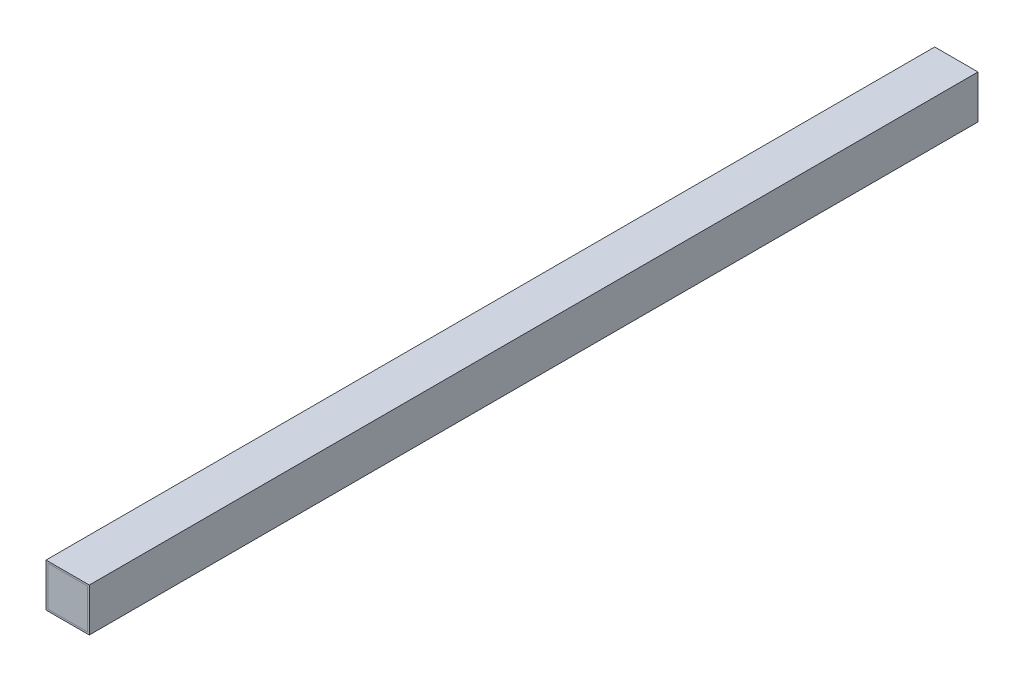
ISO-10303-21;
HEADER;
FILE_DESCRIPTION(('STEP AP214'),'2;1');
FILE_NAME('part.step','',(''),(''),'','','');
FILE_SCHEMA(('AUTOMOTIVE_DESIGN { 1 0 10303 214 1 1 1 1 }'));
ENDSEC;
DATA;
#1=APPLICATION_CONTEXT('core data for automotive mechanical design processes');
#2=APPLICATION_PROTOCOL_DEFINITION('international standard','automotive_design',2000,#1);
#3=PRODUCT_CONTEXT('',#1,'mechanical');
#4=PRODUCT('Part','Part','',(#3));
#5=PRODUCT_RELATED_PRODUCT_CATEGORY('part','',(#4));
#6=PRODUCT_DEFINITION_FORMATION('','',#4);
#7=PRODUCT_DEFINITION_CONTEXT('part definition',#1,'design');
#8=PRODUCT_DEFINITION('design','',#6,#7);
#9=PRODUCT_DEFINITION_SHAPE('','',#8);
#10=(LENGTH_UNIT() NAMED_UNIT(*) SI_UNIT(.MILLI.,.METRE.));
#11=(NAMED_UNIT(*) PLANE_ANGLE_UNIT() SI_UNIT($,.RADIAN.));
#12=(NAMED_UNIT(*) SI_UNIT($,.STERADIAN.) SOLID_ANGLE_UNIT());
#13=UNCERTAINTY_MEASURE_WITH_UNIT(LENGTH_MEASURE(1.E-05),#10,'distance_accuracy_value','');
#14=(GEOMETRIC_REPRESENTATION_CONTEXT(3) GLOBAL_UNCERTAINTY_ASSIGNED_CONTEXT((#13)) GLOBAL_UNIT_ASSIGNED_CONTEXT((#10,
#11,#12)) REPRESENTATION_CONTEXT('',''));
#15=CARTESIAN_POINT('',(0.,0.,0.));
#16=DIRECTION('',(0.,0.,1.));
#17=DIRECTION('',(1.,0.,0.));
#18=AXIS2_PLACEMENT_3D('',#15,#16,#17);
#19=CARTESIAN_POINT('',(-12.1805,12.1805,500.));
#20=DIRECTION('',(1.,0.,0.));
#21=DIRECTION('',(0.,1.,0.));
#22=AXIS2_PLACEMENT_3D('',#19,#20,#21);
#23=PLANE('',#22);
#24=DIRECTION('',(0.,-1.,0.));
#25=VECTOR('',#24,1.);
#26=CARTESIAN_POINT('',(-12.1805,12.1805,0.));
#27=LINE('',#26,#25);
#28=CARTESIAN_POINT('',(-12.1805,12.1805,0.));
#29=VERTEX_POINT('',#28);
#30=CARTESIAN_POINT('',(-12.1805,-12.1805,0.));
#31=VERTEX_POINT('',#30);
#32=EDGE_CURVE('P0_E138',#29,#31,#27,.T.);
#33=ORIENTED_EDGE('',*,*,#32,.T.);
#34=DIRECTION('',(0.,0.,-1.));
#35=VECTOR('',#34,1.);
#36=CARTESIAN_POINT('',(-12.1805,-12.1805,500.));
#37=LINE('',#36,#35);
#38=CARTESIAN_POINT('',(-12.1805,-12.1805,500.));
#39=VERTEX_POINT('',#38);
#40=EDGE_CURVE('P0_E11',#39,#31,#37,.T.);
#41=ORIENTED_EDGE('',*,*,#40,.F.);
#42=DIRECTION('',(0.,-1.,0.));
#43=VECTOR('',#42,1.);
#44=CARTESIAN_POINT('',(-12.1805,12.1805,500.));
#45=LINE('',#44,#43);
#46=CARTESIAN_POINT('',(-12.1805,12.1805,500.));
#47=VERTEX_POINT('',#46);
#48=EDGE_CURVE('P0_E142',#47,#39,#45,.T.);
#49=ORIENTED_EDGE('',*,*,#48,.F.);
#50=DIRECTION('',(0.,0.,-1.));
#51=VECTOR('',#50,1.);
#52=CARTESIAN_POINT('',(-12.1805,12.1805,500.));
#53=LINE('',#52,#51);
#54=EDGE_CURVE('P0_E152',#47,#29,#53,.T.);
#55=ORIENTED_EDGE('',*,*,#54,.T.);
#56=EDGE_LOOP('',(#33,#41,#49,#55));
#57=FACE_BOUND('',#56,.T.);
#58=ADVANCED_FACE('P0_F41',(#57),#23,.F.);
#59=CARTESIAN_POINT('',(-12.1805,-12.1805,500.));
#60=DIRECTION('',(0.,1.,0.));
#61=DIRECTION('',(0.,0.,1.));
#62=AXIS2_PLACEMENT_3D('',#59,#60,#61);
#63=PLANE('',#62);
#64=DIRECTION('',(1.,0.,0.));
#65=VECTOR('',#64,1.);
#66=CARTESIAN_POINT('',(-12.1805,-12.1805,0.));
#67=LINE('',#66,#65);
#68=CARTESIAN_POINT('',(12.1805,-12.1805,0.));
#69=VERTEX_POINT('',#68);
#70=EDGE_CURVE('P0_E155',#31,#69,#67,.T.);
#71=ORIENTED_EDGE('',*,*,#70,.T.);
#72=DIRECTION('',(0.,0.,-1.));
#73=VECTOR('',#72,1.);
#74=CARTESIAN_POINT('',(12.1805,-12.1805,500.));
#75=LINE('',#74,#73);
#76=CARTESIAN_POINT('',(12.1805,-12.1805,500.));
#77=VERTEX_POINT('',#76);
#78=EDGE_CURVE('P0_E48',#77,#69,#75,.T.);
#79=ORIENTED_EDGE('',*,*,#78,.F.);
#80=DIRECTION('',(1.,0.,0.));
#81=VECTOR('',#80,1.);
#82=CARTESIAN_POINT('',(-12.1805,-12.1805,500.));
#83=LINE('',#82,#81);
#84=EDGE_CURVE('P0_E145',#39,#77,#83,.T.);
#85=ORIENTED_EDGE('',*,*,#84,.F.);
#86=ORIENTED_EDGE('',*,*,#40,.T.);
#87=EDGE_LOOP('',(#71,#79,#85,#86));
#88=FACE_BOUND('',#87,.T.);
#89=ADVANCED_FACE('P0_F183',(#88),#63,.F.);
#90=CARTESIAN_POINT('',(12.1805,12.1805,500.));
#91=DIRECTION('',(-1.,0.,0.));
#92=DIRECTION('',(0.,-1.,0.));
#93=AXIS2_PLACEMENT_3D('',#90,#91,#92);
#94=PLANE('',#93);
#95=DIRECTION('',(0.,1.,0.));
#96=VECTOR('',#95,1.);
#97=CARTESIAN_POINT('',(12.1805,12.1805,0.));
#98=LINE('',#97,#96);
#99=CARTESIAN_POINT('',(12.1805,12.1805,0.));
#100=VERTEX_POINT('',#99);
#101=EDGE_CURVE('P0_E157',#69,#100,#98,.T.);
#102=ORIENTED_EDGE('',*,*,#101,.T.);
#103=DIRECTION('',(0.,0.,-1.));
#104=VECTOR('',#103,1.);
#105=CARTESIAN_POINT('',(12.1805,12.1805,500.));
#106=LINE('',#105,#104);
#107=CARTESIAN_POINT('',(12.1805,12.1805,500.));
#108=VERTEX_POINT('',#107);
#109=EDGE_CURVE('P0_E162',#108,#100,#106,.T.);
#110=ORIENTED_EDGE('',*,*,#109,.F.);
#111=DIRECTION('',(0.,1.,0.));
#112=VECTOR('',#111,1.);
#113=CARTESIAN_POINT('',(12.1805,12.1805,500.));
#114=LINE('',#113,#112);
#115=EDGE_CURVE('P0_E148',#77,#108,#114,.T.);
#116=ORIENTED_EDGE('',*,*,#115,.F.);
#117=ORIENTED_EDGE('',*,*,#78,.T.);
#118=EDGE_LOOP('',(#102,#110,#116,#117));
#119=FACE_BOUND('',#118,.T.);
#120=ADVANCED_FACE('P0_F169',(#119),#94,.F.);
#121=CARTESIAN_POINT('',(-12.1805,12.1805,500.));
#122=DIRECTION('',(0.,-1.,0.));
#123=DIRECTION('',(0.,0.,-1.));
#124=AXIS2_PLACEMENT_3D('',#121,#122,#123);
#125=PLANE('',#124);
#126=DIRECTION('',(-1.,0.,0.));
#127=VECTOR('',#126,1.);
#128=CARTESIAN_POINT('',(-12.1805,12.1805,0.));
#129=LINE('',#128,#127);
#130=EDGE_CURVE('P0_E146',#100,#29,#129,.T.);
#131=ORIENTED_EDGE('',*,*,#130,.T.);
#132=ORIENTED_EDGE('',*,*,#54,.F.);
#133=DIRECTION('',(-1.,0.,0.));
#134=VECTOR('',#133,1.);
#135=CARTESIAN_POINT('',(-12.1805,12.1805,500.));
#136=LINE('',#135,#134);
#137=EDGE_CURVE('P0_E150',#108,#47,#136,.T.);
#138=ORIENTED_EDGE('',*,*,#137,.F.);
#139=ORIENTED_EDGE('',*,*,#109,.T.);
#140=EDGE_LOOP('',(#131,#132,#138,#139));
#141=FACE_BOUND('',#140,.T.);
#142=ADVANCED_FACE('P0_F176',(#141),#125,.F.);
#143=CARTESIAN_POINT('',(0.,0.,500.));
#144=DIRECTION('',(0.,0.,1.));
#145=DIRECTION('',(1.,0.,0.));
#146=AXIS2_PLACEMENT_3D('',#143,#144,#145);
#147=PLANE('',#146);
#148=DIRECTION('',(0.,-1.,0.));
#149=VECTOR('',#148,1.);
#150=CARTESIAN_POINT('',(-11.1805,11.1805,500.));
#151=LINE('',#150,#149);
#152=CARTESIAN_POINT('',(-11.1805,11.1805,500.));
#153=VERTEX_POINT('',#152);
#154=CARTESIAN_POINT('',(-11.1805,-11.1805,500.));
#155=VERTEX_POINT('',#154);
#156=EDGE_CURVE('P0_E55',#153,#155,#151,.T.);
#157=ORIENTED_EDGE('',*,*,#156,.F.);
#158=DIRECTION('',(-1.,0.,0.));
#159=VECTOR('',#158,1.);
#160=CARTESIAN_POINT('',(-11.1805,11.1805,500.));
#161=LINE('',#160,#159);
#162=CARTESIAN_POINT('',(11.1805,11.1805,500.));
#163=VERTEX_POINT('',#162);
#164=EDGE_CURVE('P0_E123',#163,#153,#161,.T.);
#165=ORIENTED_EDGE('',*,*,#164,.F.);
#166=DIRECTION('',(0.,1.,0.));
#167=VECTOR('',#166,1.);
#168=CARTESIAN_POINT('',(11.1805,11.1805,500.));
#169=LINE('',#168,#167);
#170=CARTESIAN_POINT('',(11.1805,-11.1805,500.));
#171=VERTEX_POINT('',#170);
#172=EDGE_CURVE('P0_E126',#171,#163,#169,.T.);
#173=ORIENTED_EDGE('',*,*,#172,.F.);
#174=DIRECTION('',(1.,0.,0.));
#175=VECTOR('',#174,1.);
#176=CARTESIAN_POINT('',(-11.1805,-11.1805,500.));
#177=LINE('',#176,#175);
#178=EDGE_CURVE('P0_E132',#155,#171,#177,.T.);
#179=ORIENTED_EDGE('',*,*,#178,.F.);
#180=EDGE_LOOP('',(#157,#165,#173,#179));
#181=FACE_BOUND('',#180,.T.);
#182=ORIENTED_EDGE('',*,*,#48,.T.);
#183=ORIENTED_EDGE('',*,*,#84,.T.);
#184=ORIENTED_EDGE('',*,*,#115,.T.);
#185=ORIENTED_EDGE('',*,*,#137,.T.);
#186=EDGE_LOOP('',(#182,#183,#184,#185));
#187=FACE_BOUND('',#186,.T.);
#188=ADVANCED_FACE('P0_F182',(#181,#187),#147,.T.);
#189=CARTESIAN_POINT('',(0.,0.,0.));
#190=DIRECTION('',(0.,0.,1.));
#191=DIRECTION('',(1.,0.,0.));
#192=AXIS2_PLACEMENT_3D('',#189,#190,#191);
#193=PLANE('',#192);
#194=DIRECTION('',(-1.,0.,0.));
#195=VECTOR('',#194,1.);
#196=CARTESIAN_POINT('',(-11.1805,11.1805,0.));
#197=LINE('',#196,#195);
#198=CARTESIAN_POINT('',(11.1805,11.1805,0.));
#199=VERTEX_POINT('',#198);
#200=CARTESIAN_POINT('',(-11.1805,11.1805,0.));
#201=VERTEX_POINT('',#200);
#202=EDGE_CURVE('P0_E113',#199,#201,#197,.T.);
#203=ORIENTED_EDGE('',*,*,#202,.T.);
#204=DIRECTION('',(0.,-1.,0.));
#205=VECTOR('',#204,1.);
#206=CARTESIAN_POINT('',(-11.1805,11.1805,0.));
#207=LINE('',#206,#205);
#208=CARTESIAN_POINT('',(-11.1805,-11.1805,0.));
#209=VERTEX_POINT('',#208);
#210=EDGE_CURVE('P0_E107',#201,#209,#207,.T.);
#211=ORIENTED_EDGE('',*,*,#210,.T.);
#212=DIRECTION('',(1.,0.,0.));
#213=VECTOR('',#212,1.);
#214=CARTESIAN_POINT('',(-11.1805,-11.1805,0.));
#215=LINE('',#214,#213);
#216=CARTESIAN_POINT('',(11.1805,-11.1805,0.));
#217=VERTEX_POINT('',#216);
#218=EDGE_CURVE('P0_E116',#209,#217,#215,.T.);
#219=ORIENTED_EDGE('',*,*,#218,.T.);
#220=DIRECTION('',(0.,1.,0.));
#221=VECTOR('',#220,1.);
#222=CARTESIAN_POINT('',(11.1805,11.1805,0.));
#223=LINE('',#222,#221);
#224=EDGE_CURVE('P0_E63',#217,#199,#223,.T.);
#225=ORIENTED_EDGE('',*,*,#224,.T.);
#226=EDGE_LOOP('',(#203,#211,#219,#225));
#227=FACE_BOUND('',#226,.T.);
#228=ORIENTED_EDGE('',*,*,#32,.F.);
#229=ORIENTED_EDGE('',*,*,#130,.F.);
#230=ORIENTED_EDGE('',*,*,#101,.F.);
#231=ORIENTED_EDGE('',*,*,#70,.F.);
#232=EDGE_LOOP('',(#228,#229,#230,#231));
#233=FACE_BOUND('',#232,.T.);
#234=ADVANCED_FACE('P0_F120',(#227,#233),#193,.F.);
#235=CARTESIAN_POINT('',(-11.1805,11.1805,0.));
#236=DIRECTION('',(-1.,0.,0.));
#237=DIRECTION('',(0.,-1.,0.));
#238=AXIS2_PLACEMENT_3D('',#235,#236,#237);
#239=PLANE('',#238);
#240=ORIENTED_EDGE('',*,*,#156,.T.);
#241=DIRECTION('',(0.,0.,1.));
#242=VECTOR('',#241,1.);
#243=CARTESIAN_POINT('',(-11.1805,-11.1805,0.));
#244=LINE('',#243,#242);
#245=EDGE_CURVE('P0_E103',#209,#155,#244,.T.);
#246=ORIENTED_EDGE('',*,*,#245,.F.);
#247=ORIENTED_EDGE('',*,*,#210,.F.);
#248=DIRECTION('',(0.,0.,1.));
#249=VECTOR('',#248,1.);
#250=CARTESIAN_POINT('',(-11.1805,11.1805,0.));
#251=LINE('',#250,#249);
#252=EDGE_CURVE('P0_E136',#201,#153,#251,.T.);
#253=ORIENTED_EDGE('',*,*,#252,.T.);
#254=EDGE_LOOP('',(#240,#246,#247,#253));
#255=FACE_BOUND('',#254,.T.);
#256=ADVANCED_FACE('P0_F105',(#255),#239,.F.);
#257=CARTESIAN_POINT('',(-11.1805,11.1805,0.));
#258=DIRECTION('',(0.,1.,0.));
#259=DIRECTION('',(0.,0.,1.));
#260=AXIS2_PLACEMENT_3D('',#257,#258,#259);
#261=PLANE('',#260);
#262=ORIENTED_EDGE('',*,*,#164,.T.);
#263=ORIENTED_EDGE('',*,*,#252,.F.);
#264=ORIENTED_EDGE('',*,*,#202,.F.);
#265=DIRECTION('',(0.,0.,1.));
#266=VECTOR('',#265,1.);
#267=CARTESIAN_POINT('',(11.1805,11.1805,0.));
#268=LINE('',#267,#266);
#269=EDGE_CURVE('P0_E139',#199,#163,#268,.T.);
#270=ORIENTED_EDGE('',*,*,#269,.T.);
#271=EDGE_LOOP('',(#262,#263,#264,#270));
#272=FACE_BOUND('',#271,.T.);
#273=ADVANCED_FACE('P0_F200',(#272),#261,.F.);
#274=CARTESIAN_POINT('',(11.1805,11.1805,0.));
#275=DIRECTION('',(1.,0.,0.));
#276=DIRECTION('',(0.,1.,0.));
#277=AXIS2_PLACEMENT_3D('',#274,#275,#276);
#278=PLANE('',#277);
#279=ORIENTED_EDGE('',*,*,#172,.T.);
#280=ORIENTED_EDGE('',*,*,#269,.F.);
#281=ORIENTED_EDGE('',*,*,#224,.F.);
#282=DIRECTION('',(0.,0.,1.));
#283=VECTOR('',#282,1.);
#284=CARTESIAN_POINT('',(11.1805,-11.1805,0.));
#285=LINE('',#284,#283);
#286=EDGE_CURVE('P0_E112',#217,#171,#285,.T.);
#287=ORIENTED_EDGE('',*,*,#286,.T.);
#288=EDGE_LOOP('',(#279,#280,#281,#287));
#289=FACE_BOUND('',#288,.T.);
#290=ADVANCED_FACE('P0_F203',(#289),#278,.F.);
#291=CARTESIAN_POINT('',(-11.1805,-11.1805,0.));
#292=DIRECTION('',(0.,-1.,0.));
#293=DIRECTION('',(1.,0.,0.));
#294=AXIS2_PLACEMENT_3D('',#291,#292,#293);
#295=PLANE('',#294);
#296=ORIENTED_EDGE('',*,*,#178,.T.);
#297=ORIENTED_EDGE('',*,*,#286,.F.);
#298=ORIENTED_EDGE('',*,*,#218,.F.);
#299=ORIENTED_EDGE('',*,*,#245,.T.);
#300=EDGE_LOOP('',(#296,#297,#298,#299));
#301=FACE_BOUND('',#300,.T.);
#302=ADVANCED_FACE('P0_F117',(#301),#295,.F.);
#303=CLOSED_SHELL('',(#58,#89,#120,#142,#188,#234,#256,#273,#290,#302));
#304=MANIFOLD_SOLID_BREP('P0_B2',#303);
#305=CARTESIAN_POINT('',(11.4967322946822,-11.4967322946822,0.529841106618992));
#306=DIRECTION('',(0.,-1.,0.));
#307=DIRECTION('',(1.,0.,0.));
#308=AXIS2_PLACEMENT_3D('',#305,#306,#307);
#309=PLANE('',#308);
#310=DIRECTION('',(-1.,0.,0.));
#311=VECTOR('',#310,1.);
#312=CARTESIAN_POINT('',(11.4967322946822,-11.4967322946822,0.001));
#313=LINE('',#312,#311);
#314=CARTESIAN_POINT('',(11.4967322946822,-11.4967322946822,0.001));
#315=VERTEX_POINT('',#314);
#316=CARTESIAN_POINT('',(-11.4967322946822,-11.4967322946822,0.001));
#317=VERTEX_POINT('',#316);
#318=EDGE_CURVE('P1_E80',#315,#317,#313,.T.);
#319=ORIENTED_EDGE('',*,*,#318,.F.);
#320=DIRECTION('',(0.,0.,-1.));
#321=VECTOR('',#320,1.);
#322=CARTESIAN_POINT('',(11.4967322946822,-11.4967322946822,0.529841106618992));
#323=LINE('',#322,#321);
#324=CARTESIAN_POINT('',(11.4967322946822,-11.4967322946822,0.529841106618992));
#325=VERTEX_POINT('',#324);
#326=EDGE_CURVE('P1_E33',#325,#315,#323,.T.);
#327=ORIENTED_EDGE('',*,*,#326,.F.);
#328=DIRECTION('',(-1.,0.,0.));
#329=VECTOR('',#328,1.);
#330=CARTESIAN_POINT('',(11.4967322946822,-11.4967322946822,0.529841106618992));
#331=LINE('',#330,#329);
#332=CARTESIAN_POINT('',(-11.4967322946822,-11.4967322946822,0.529841106618992));
#333=VERTEX_POINT('',#332);
#334=EDGE_CURVE('P1_E72',#325,#333,#331,.T.);
#335=ORIENTED_EDGE('',*,*,#334,.T.);
#336=DIRECTION('',(0.,0.,-1.));
#337=VECTOR('',#336,1.);
#338=CARTESIAN_POINT('',(-11.4967322946822,-11.4967322946822,0.529841106618992));
#339=LINE('',#338,#337);
#340=EDGE_CURVE('P1_E11',#333,#317,#339,.T.);
#341=ORIENTED_EDGE('',*,*,#340,.T.);
#342=EDGE_LOOP('',(#319,#327,#335,#341));
#343=FACE_BOUND('',#342,.T.);
#344=ADVANCED_FACE('P1_F17',(#343),#309,.T.);
#345=CARTESIAN_POINT('',(-11.4967322946822,-11.4967322946823,0.529841106618992));
#346=DIRECTION('',(-1.,0.,0.));
#347=DIRECTION('',(0.,-1.,0.));
#348=AXIS2_PLACEMENT_3D('',#345,#346,#347);
#349=PLANE('',#348);
#350=DIRECTION('',(0.,1.,0.));
#351=VECTOR('',#350,1.);
#352=CARTESIAN_POINT('',(-11.4967322946822,-11.4967322946823,0.001));
#353=LINE('',#352,#351);
#354=CARTESIAN_POINT('',(-11.4967322946823,11.4967322946822,0.001));
#355=VERTEX_POINT('',#354);
#356=EDGE_CURVE('P1_E83',#317,#355,#353,.T.);
#357=ORIENTED_EDGE('',*,*,#356,.F.);
#358=ORIENTED_EDGE('',*,*,#340,.F.);
#359=DIRECTION('',(0.,1.,0.));
#360=VECTOR('',#359,1.);
#361=CARTESIAN_POINT('',(-11.4967322946822,-11.4967322946823,0.529841106618992));
#362=LINE('',#361,#360);
#363=CARTESIAN_POINT('',(-11.4967322946823,11.4967322946822,0.529841106618992));
#364=VERTEX_POINT('',#363);
#365=EDGE_CURVE('P1_E68',#333,#364,#362,.T.);
#366=ORIENTED_EDGE('',*,*,#365,.T.);
#367=DIRECTION('',(0.,0.,-1.));
#368=VECTOR('',#367,1.);
#369=CARTESIAN_POINT('',(-11.4967322946823,11.4967322946822,0.529841106618992));
#370=LINE('',#369,#368);
#371=EDGE_CURVE('P1_E25',#364,#355,#370,.T.);
#372=ORIENTED_EDGE('',*,*,#371,.T.);
#373=EDGE_LOOP('',(#357,#358,#366,#372));
#374=FACE_BOUND('',#373,.T.);
#375=ADVANCED_FACE('P1_F69',(#374),#349,.T.);
#376=CARTESIAN_POINT('',(-11.4967322946823,11.4967322946822,0.529841106618992));
#377=DIRECTION('',(0.,1.,0.));
#378=DIRECTION('',(0.,0.,1.));
#379=AXIS2_PLACEMENT_3D('',#376,#377,#378);
#380=PLANE('',#379);
#381=DIRECTION('',(1.,0.,0.));
#382=VECTOR('',#381,1.);
#383=CARTESIAN_POINT('',(-11.4967322946823,11.4967322946822,0.001));
#384=LINE('',#383,#382);
#385=CARTESIAN_POINT('',(11.4967322946822,11.4967322946822,0.001));
#386=VERTEX_POINT('',#385);
#387=EDGE_CURVE('P1_E66',#355,#386,#384,.T.);
#388=ORIENTED_EDGE('',*,*,#387,.F.);
#389=ORIENTED_EDGE('',*,*,#371,.F.);
#390=DIRECTION('',(1.,0.,0.));
#391=VECTOR('',#390,1.);
#392=CARTESIAN_POINT('',(-11.4967322946823,11.4967322946822,0.529841106618992));
#393=LINE('',#392,#391);
#394=CARTESIAN_POINT('',(11.4967322946822,11.4967322946822,0.529841106618992));
#395=VERTEX_POINT('',#394);
#396=EDGE_CURVE('P1_E63',#364,#395,#393,.T.);
#397=ORIENTED_EDGE('',*,*,#396,.T.);
#398=DIRECTION('',(0.,0.,-1.));
#399=VECTOR('',#398,1.);
#400=CARTESIAN_POINT('',(11.4967322946822,11.4967322946822,0.529841106618992));
#401=LINE('',#400,#399);
#402=EDGE_CURVE('P1_E49',#395,#386,#401,.T.);
#403=ORIENTED_EDGE('',*,*,#402,.T.);
#404=EDGE_LOOP('',(#388,#389,#397,#403));
#405=FACE_BOUND('',#404,.T.);
#406=ADVANCED_FACE('P1_F61',(#405),#380,.T.);
#407=CARTESIAN_POINT('',(11.4967322946822,11.4967322946822,0.529841106618992));
#408=DIRECTION('',(1.,0.,0.));
#409=DIRECTION('',(0.,1.,0.));
#410=AXIS2_PLACEMENT_3D('',#407,#408,#409);
#411=PLANE('',#410);
#412=DIRECTION('',(0.,-1.,0.));
#413=VECTOR('',#412,1.);
#414=CARTESIAN_POINT('',(11.4967322946822,11.4967322946822,0.001));
#415=LINE('',#414,#413);
#416=EDGE_CURVE('P1_E86',#386,#315,#415,.T.);
#417=ORIENTED_EDGE('',*,*,#416,.F.);
#418=ORIENTED_EDGE('',*,*,#402,.F.);
#419=DIRECTION('',(0.,-1.,0.));
#420=VECTOR('',#419,1.);
#421=CARTESIAN_POINT('',(11.4967322946822,11.4967322946822,0.529841106618992));
#422=LINE('',#421,#420);
#423=EDGE_CURVE('P1_E75',#395,#325,#422,.T.);
#424=ORIENTED_EDGE('',*,*,#423,.T.);
#425=ORIENTED_EDGE('',*,*,#326,.T.);
#426=EDGE_LOOP('',(#417,#418,#424,#425));
#427=FACE_BOUND('',#426,.T.);
#428=ADVANCED_FACE('P1_F97',(#427),#411,.T.);
#429=CARTESIAN_POINT('',(0.,11.1805,0.529841106618992));
#430=DIRECTION('',(0.,0.,-1.));
#431=DIRECTION('',(0.,1.,0.));
#432=AXIS2_PLACEMENT_3D('',#429,#430,#431);
#433=PLANE('',#432);
#434=ORIENTED_EDGE('',*,*,#334,.F.);
#435=ORIENTED_EDGE('',*,*,#423,.F.);
#436=ORIENTED_EDGE('',*,*,#396,.F.);
#437=ORIENTED_EDGE('',*,*,#365,.F.);
#438=EDGE_LOOP('',(#434,#435,#436,#437));
#439=FACE_BOUND('',#438,.T.);
#440=ADVANCED_FACE('P1_F74',(#439),#433,.F.);
#441=CARTESIAN_POINT('',(0.,11.1805,0.001));
#442=DIRECTION('',(0.,0.,-1.));
#443=DIRECTION('',(0.,1.,0.));
#444=AXIS2_PLACEMENT_3D('',#441,#442,#443);
#445=PLANE('',#444);
#446=ORIENTED_EDGE('',*,*,#318,.T.);
#447=ORIENTED_EDGE('',*,*,#356,.T.);
#448=ORIENTED_EDGE('',*,*,#387,.T.);
#449=ORIENTED_EDGE('',*,*,#416,.T.);
#450=EDGE_LOOP('',(#446,#447,#448,#449));
#451=FACE_BOUND('',#450,.T.);
#452=ADVANCED_FACE('P1_F90',(#451),#445,.T.);
#453=CLOSED_SHELL('',(#344,#375,#406,#428,#440,#452));
#454=MANIFOLD_SOLID_BREP('P1_B1',#453);
#455=CARTESIAN_POINT('',(-11.4967322946823,-11.4967322946822,497.493072443974));
#456=DIRECTION('',(0.,-1.,0.));
#457=DIRECTION('',(1.,0.,0.));
#458=AXIS2_PLACEMENT_3D('',#455,#456,#457);
#459=PLANE('',#458);
#460=DIRECTION('',(1.,0.,0.));
#461=VECTOR('',#460,1.);
#462=CARTESIAN_POINT('',(-11.4967322946823,-11.4967322946822,499.999));
#463=LINE('',#462,#461);
#464=CARTESIAN_POINT('',(-11.4967322946823,-11.4967322946822,499.999));
#465=VERTEX_POINT('',#464);
#466=CARTESIAN_POINT('',(11.4967322946822,-11.4967322946822,499.999));
#467=VERTEX_POINT('',#466);
#468=EDGE_CURVE('P2_E80',#465,#467,#463,.T.);
#469=ORIENTED_EDGE('',*,*,#468,.F.);
#470=DIRECTION('',(0.,0.,1.));
#471=VECTOR('',#470,1.);
#472=CARTESIAN_POINT('',(-11.4967322946823,-11.4967322946822,497.493072443974));
#473=LINE('',#472,#471);
#474=CARTESIAN_POINT('',(-11.4967322946823,-11.4967322946822,497.493072443974));
#475=VERTEX_POINT('',#474);
#476=EDGE_CURVE('P2_E33',#475,#465,#473,.T.);
#477=ORIENTED_EDGE('',*,*,#476,.F.);
#478=DIRECTION('',(1.,0.,0.));
#479=VECTOR('',#478,1.);
#480=CARTESIAN_POINT('',(-11.4967322946823,-11.4967322946822,497.493072443974));
#481=LINE('',#480,#479);
#482=CARTESIAN_POINT('',(11.4967322946822,-11.4967322946822,497.493072443974));
#483=VERTEX_POINT('',#482);
#484=EDGE_CURVE('P2_E72',#475,#483,#481,.T.);
#485=ORIENTED_EDGE('',*,*,#484,.T.);
#486=DIRECTION('',(0.,0.,1.));
#487=VECTOR('',#486,1.);
#488=CARTESIAN_POINT('',(11.4967322946822,-11.4967322946822,497.493072443974));
#489=LINE('',#488,#487);
#490=EDGE_CURVE('P2_E11',#483,#467,#489,.T.);
#491=ORIENTED_EDGE('',*,*,#490,.T.);
#492=EDGE_LOOP('',(#469,#477,#485,#491));
#493=FACE_BOUND('',#492,.T.);
#494=ADVANCED_FACE('P2_F17',(#493),#459,.T.);
#495=CARTESIAN_POINT('',(11.4967322946822,-11.4967322946822,497.493072443974));
#496=DIRECTION('',(1.,0.,0.));
#497=DIRECTION('',(0.,1.,0.));
#498=AXIS2_PLACEMENT_3D('',#495,#496,#497);
#499=PLANE('',#498);
#500=DIRECTION('',(0.,1.,0.));
#501=VECTOR('',#500,1.);
#502=CARTESIAN_POINT('',(11.4967322946822,-11.4967322946822,499.999));
#503=LINE('',#502,#501);
#504=CARTESIAN_POINT('',(11.4967322946822,11.4967322946822,499.999));
#505=VERTEX_POINT('',#504);
#506=EDGE_CURVE('P2_E83',#467,#505,#503,.T.);
#507=ORIENTED_EDGE('',*,*,#506,.F.);
#508=ORIENTED_EDGE('',*,*,#490,.F.);
#509=DIRECTION('',(0.,1.,0.));
#510=VECTOR('',#509,1.);
#511=CARTESIAN_POINT('',(11.4967322946822,-11.4967322946822,497.493072443974));
#512=LINE('',#511,#510);
#513=CARTESIAN_POINT('',(11.4967322946822,11.4967322946822,497.493072443974));
#514=VERTEX_POINT('',#513);
#515=EDGE_CURVE('P2_E68',#483,#514,#512,.T.);
#516=ORIENTED_EDGE('',*,*,#515,.T.);
#517=DIRECTION('',(0.,0.,1.));
#518=VECTOR('',#517,1.);
#519=CARTESIAN_POINT('',(11.4967322946822,11.4967322946822,497.493072443974));
#520=LINE('',#519,#518);
#521=EDGE_CURVE('P2_E25',#514,#505,#520,.T.);
#522=ORIENTED_EDGE('',*,*,#521,.T.);
#523=EDGE_LOOP('',(#507,#508,#516,#522));
#524=FACE_BOUND('',#523,.T.);
#525=ADVANCED_FACE('P2_F69',(#524),#499,.T.);
#526=CARTESIAN_POINT('',(11.4967322946822,11.4967322946822,497.493072443974));
#527=DIRECTION('',(0.,1.,0.));
#528=DIRECTION('',(0.,0.,1.));
#529=AXIS2_PLACEMENT_3D('',#526,#527,#528);
#530=PLANE('',#529);
#531=DIRECTION('',(-1.,0.,0.));
#532=VECTOR('',#531,1.);
#533=CARTESIAN_POINT('',(11.4967322946822,11.4967322946822,499.999));
#534=LINE('',#533,#532);
#535=CARTESIAN_POINT('',(-11.4967322946823,11.4967322946822,499.999));
#536=VERTEX_POINT('',#535);
#537=EDGE_CURVE('P2_E66',#505,#536,#534,.T.);
#538=ORIENTED_EDGE('',*,*,#537,.F.);
#539=ORIENTED_EDGE('',*,*,#521,.F.);
#540=DIRECTION('',(-1.,0.,0.));
#541=VECTOR('',#540,1.);
#542=CARTESIAN_POINT('',(11.4967322946822,11.4967322946822,497.493072443974));
#543=LINE('',#542,#541);
#544=CARTESIAN_POINT('',(-11.4967322946823,11.4967322946822,497.493072443974));
#545=VERTEX_POINT('',#544);
#546=EDGE_CURVE('P2_E63',#514,#545,#543,.T.);
#547=ORIENTED_EDGE('',*,*,#546,.T.);
#548=DIRECTION('',(0.,0.,1.));
#549=VECTOR('',#548,1.);
#550=CARTESIAN_POINT('',(-11.4967322946823,11.4967322946822,497.493072443974));
#551=LINE('',#550,#549);
#552=EDGE_CURVE('P2_E49',#545,#536,#551,.T.);
#553=ORIENTED_EDGE('',*,*,#552,.T.);
#554=EDGE_LOOP('',(#538,#539,#547,#553));
#555=FACE_BOUND('',#554,.T.);
#556=ADVANCED_FACE('P2_F61',(#555),#530,.T.);
#557=CARTESIAN_POINT('',(-11.4967322946823,11.4967322946822,497.493072443974));
#558=DIRECTION('',(-1.,0.,0.));
#559=DIRECTION('',(0.,-1.,0.));
#560=AXIS2_PLACEMENT_3D('',#557,#558,#559);
#561=PLANE('',#560);
#562=DIRECTION('',(0.,-1.,0.));
#563=VECTOR('',#562,1.);
#564=CARTESIAN_POINT('',(-11.4967322946823,11.4967322946822,499.999));
#565=LINE('',#564,#563);
#566=EDGE_CURVE('P2_E86',#536,#465,#565,.T.);
#567=ORIENTED_EDGE('',*,*,#566,.F.);
#568=ORIENTED_EDGE('',*,*,#552,.F.);
#569=DIRECTION('',(0.,-1.,0.));
#570=VECTOR('',#569,1.);
#571=CARTESIAN_POINT('',(-11.4967322946823,11.4967322946822,497.493072443974));
#572=LINE('',#571,#570);
#573=EDGE_CURVE('P2_E75',#545,#475,#572,.T.);
#574=ORIENTED_EDGE('',*,*,#573,.T.);
#575=ORIENTED_EDGE('',*,*,#476,.T.);
#576=EDGE_LOOP('',(#567,#568,#574,#575));
#577=FACE_BOUND('',#576,.T.);
#578=ADVANCED_FACE('P2_F97',(#577),#561,.T.);
#579=CARTESIAN_POINT('',(0.,11.1805,497.493072443974));
#580=DIRECTION('',(0.,0.,1.));
#581=DIRECTION('',(0.,-1.,0.));
#582=AXIS2_PLACEMENT_3D('',#579,#580,#581);
#583=PLANE('',#582);
#584=ORIENTED_EDGE('',*,*,#484,.F.);
#585=ORIENTED_EDGE('',*,*,#573,.F.);
#586=ORIENTED_EDGE('',*,*,#546,.F.);
#587=ORIENTED_EDGE('',*,*,#515,.F.);
#588=EDGE_LOOP('',(#584,#585,#586,#587));
#589=FACE_BOUND('',#588,.T.);
#590=ADVANCED_FACE('P2_F74',(#589),#583,.F.);
#591=CARTESIAN_POINT('',(0.,11.1805,499.999));
#592=DIRECTION('',(0.,0.,1.));
#593=DIRECTION('',(0.,-1.,0.));
#594=AXIS2_PLACEMENT_3D('',#591,#592,#593);
#595=PLANE('',#594);
#596=ORIENTED_EDGE('',*,*,#468,.T.);
#597=ORIENTED_EDGE('',*,*,#506,.T.);
#598=ORIENTED_EDGE('',*,*,#537,.T.);
#599=ORIENTED_EDGE('',*,*,#566,.T.);
#600=EDGE_LOOP('',(#596,#597,#598,#599));
#601=FACE_BOUND('',#600,.T.);
#602=ADVANCED_FACE('P2_F90',(#601),#595,.T.);
#603=CLOSED_SHELL('',(#494,#525,#556,#578,#590,#602));
#604=MANIFOLD_SOLID_BREP('P2_B1',#603);
#605=ADVANCED_BREP_SHAPE_REPRESENTATION('',(#18,#304,#454,#604),#14);
#606=SHAPE_DEFINITION_REPRESENTATION(#9,#605);
ENDSEC;
END-ISO-10303-21;
